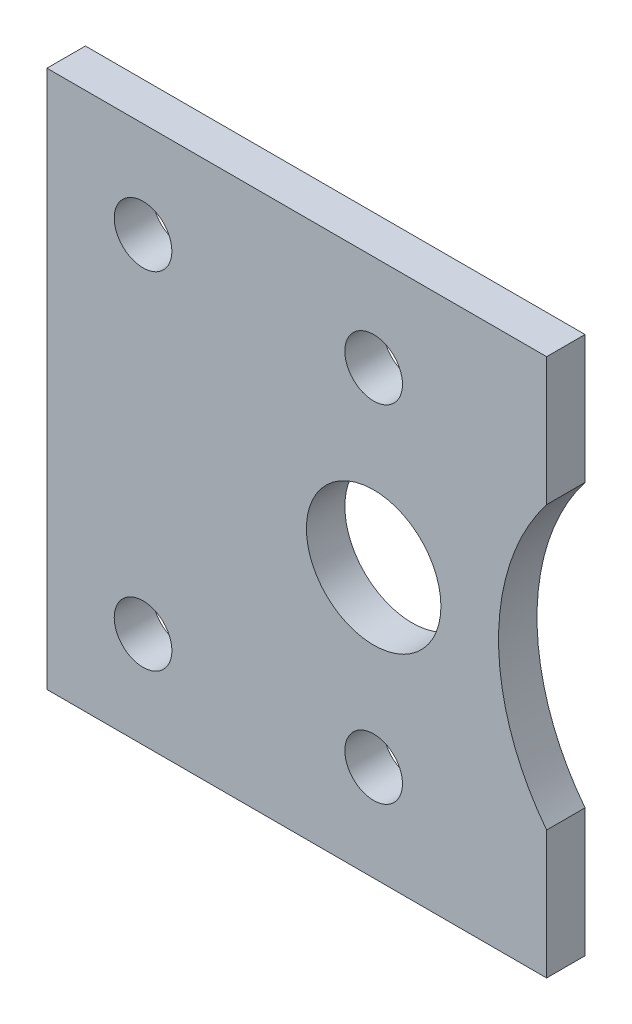
ISO-10303-21;
HEADER;
FILE_DESCRIPTION(('STEP AP214'),'2;1');
FILE_NAME('part.step','',(''),(''),'','','');
FILE_SCHEMA(('AUTOMOTIVE_DESIGN { 1 0 10303 214 1 1 1 1 }'));
ENDSEC;
DATA;
#1=APPLICATION_CONTEXT('core data for automotive mechanical design processes');
#2=APPLICATION_PROTOCOL_DEFINITION('international standard','automotive_design',2000,#1);
#3=PRODUCT_CONTEXT('',#1,'mechanical');
#4=PRODUCT('Part','Part','',(#3));
#5=PRODUCT_RELATED_PRODUCT_CATEGORY('part','',(#4));
#6=PRODUCT_DEFINITION_FORMATION('','',#4);
#7=PRODUCT_DEFINITION_CONTEXT('part definition',#1,'design');
#8=PRODUCT_DEFINITION('design','',#6,#7);
#9=PRODUCT_DEFINITION_SHAPE('','',#8);
#10=(LENGTH_UNIT() NAMED_UNIT(*) SI_UNIT(.MILLI.,.METRE.));
#11=(NAMED_UNIT(*) PLANE_ANGLE_UNIT() SI_UNIT($,.RADIAN.));
#12=(NAMED_UNIT(*) SI_UNIT($,.STERADIAN.) SOLID_ANGLE_UNIT());
#13=UNCERTAINTY_MEASURE_WITH_UNIT(LENGTH_MEASURE(1.E-05),#10,'distance_accuracy_value','');
#14=(GEOMETRIC_REPRESENTATION_CONTEXT(3) GLOBAL_UNCERTAINTY_ASSIGNED_CONTEXT((#13)) GLOBAL_UNIT_ASSIGNED_CONTEXT((#10,
#11,#12)) REPRESENTATION_CONTEXT('',''));
#15=CARTESIAN_POINT('',(0.,0.,0.));
#16=DIRECTION('',(0.,0.,1.));
#17=DIRECTION('',(1.,0.,0.));
#18=AXIS2_PLACEMENT_3D('',#15,#16,#17);
#19=CARTESIAN_POINT('',(18.5,0.,2.));
#20=DIRECTION('',(0.,0.,1.));
#21=DIRECTION('',(1.,0.,0.));
#22=AXIS2_PLACEMENT_3D('',#19,#20,#21);
#23=PLANE('',#22);
#24=CARTESIAN_POINT('',(-12.,-9.,2.));
#25=DIRECTION('',(0.,0.,1.));
#26=DIRECTION('',(-1.,0.,0.));
#27=AXIS2_PLACEMENT_3D('',#24,#25,#26);
#28=CIRCLE('',#27,1.5);
#29=CARTESIAN_POINT('',(-13.5,-9.,2.));
#30=VERTEX_POINT('',#29);
#31=EDGE_CURVE('E203',#30,#30,#28,.T.);
#32=ORIENTED_EDGE('',*,*,#31,.F.);
#33=EDGE_LOOP('',(#32));
#34=FACE_BOUND('',#33,.T.);
#35=CARTESIAN_POINT('',(-12.,9.,2.));
#36=DIRECTION('',(0.,0.,1.));
#37=DIRECTION('',(1.,0.,0.));
#38=AXIS2_PLACEMENT_3D('',#35,#36,#37);
#39=CIRCLE('',#38,1.5);
#40=CARTESIAN_POINT('',(-10.5,9.,2.));
#41=VERTEX_POINT('',#40);
#42=EDGE_CURVE('E215',#41,#41,#39,.T.);
#43=ORIENTED_EDGE('',*,*,#42,.F.);
#44=EDGE_LOOP('',(#43));
#45=FACE_BOUND('',#44,.T.);
#46=DIRECTION('',(0.,-1.,0.));
#47=VECTOR('',#46,1.);
#48=CARTESIAN_POINT('',(-17.,14.,2.));
#49=LINE('',#48,#47);
#50=CARTESIAN_POINT('',(-17.,14.,2.));
#51=VERTEX_POINT('',#50);
#52=CARTESIAN_POINT('',(-17.,-14.,2.));
#53=VERTEX_POINT('',#52);
#54=EDGE_CURVE('E139',#51,#53,#49,.T.);
#55=ORIENTED_EDGE('',*,*,#54,.T.);
#56=DIRECTION('',(1.,0.,0.));
#57=VECTOR('',#56,1.);
#58=CARTESIAN_POINT('',(-17.,-14.,2.));
#59=LINE('',#58,#57);
#60=CARTESIAN_POINT('',(9.,-14.,2.));
#61=VERTEX_POINT('',#60);
#62=EDGE_CURVE('E97',#53,#61,#59,.T.);
#63=ORIENTED_EDGE('',*,*,#62,.T.);
#64=DIRECTION('',(0.,1.,0.));
#65=VECTOR('',#64,1.);
#66=CARTESIAN_POINT('',(9.,-14.,2.));
#67=LINE('',#66,#65);
#68=CARTESIAN_POINT('',(9.,-7.33143914930759,2.));
#69=VERTEX_POINT('',#68);
#70=EDGE_CURVE('E110',#61,#69,#67,.T.);
#71=ORIENTED_EDGE('',*,*,#70,.T.);
#72=CARTESIAN_POINT('',(18.5,0.,2.));
#73=DIRECTION('',(0.,0.,-1.));
#74=DIRECTION('',(1.,0.,0.));
#75=AXIS2_PLACEMENT_3D('',#72,#73,#74);
#76=CIRCLE('',#75,12.);
#77=CARTESIAN_POINT('',(9.,7.33143914930759,2.));
#78=VERTEX_POINT('',#77);
#79=EDGE_CURVE('E104',#69,#78,#76,.T.);
#80=ORIENTED_EDGE('',*,*,#79,.T.);
#81=DIRECTION('',(0.,1.,0.));
#82=VECTOR('',#81,1.);
#83=CARTESIAN_POINT('',(9.,7.33143914930759,2.));
#84=LINE('',#83,#82);
#85=CARTESIAN_POINT('',(9.,14.,2.));
#86=VERTEX_POINT('',#85);
#87=EDGE_CURVE('E108',#78,#86,#84,.T.);
#88=ORIENTED_EDGE('',*,*,#87,.T.);
#89=DIRECTION('',(-1.,0.,0.));
#90=VECTOR('',#89,1.);
#91=CARTESIAN_POINT('',(9.,14.,2.));
#92=LINE('',#91,#90);
#93=EDGE_CURVE('E60',#86,#51,#92,.T.);
#94=ORIENTED_EDGE('',*,*,#93,.T.);
#95=EDGE_LOOP('',(#55,#63,#71,#80,#88,#94));
#96=FACE_BOUND('',#95,.T.);
#97=CARTESIAN_POINT('',(0.,0.,2.));
#98=DIRECTION('',(0.,0.,1.));
#99=DIRECTION('',(1.,0.,0.));
#100=AXIS2_PLACEMENT_3D('',#97,#98,#99);
#101=CIRCLE('',#100,3.5);
#102=CARTESIAN_POINT('',(3.5,0.,2.));
#103=VERTEX_POINT('',#102);
#104=EDGE_CURVE('E132',#103,#103,#101,.T.);
#105=ORIENTED_EDGE('',*,*,#104,.F.);
#106=EDGE_LOOP('',(#105));
#107=FACE_BOUND('',#106,.T.);
#108=CARTESIAN_POINT('',(0.,9.,2.));
#109=DIRECTION('',(0.,0.,1.));
#110=DIRECTION('',(1.,0.,0.));
#111=AXIS2_PLACEMENT_3D('',#108,#109,#110);
#112=CIRCLE('',#111,1.5);
#113=CARTESIAN_POINT('',(1.5,9.,2.));
#114=VERTEX_POINT('',#113);
#115=EDGE_CURVE('E209',#114,#114,#112,.T.);
#116=ORIENTED_EDGE('',*,*,#115,.F.);
#117=EDGE_LOOP('',(#116));
#118=FACE_BOUND('',#117,.T.);
#119=CARTESIAN_POINT('',(0.,-9.,2.));
#120=DIRECTION('',(0.,0.,1.));
#121=DIRECTION('',(-1.,0.,0.));
#122=AXIS2_PLACEMENT_3D('',#119,#120,#121);
#123=CIRCLE('',#122,1.5);
#124=CARTESIAN_POINT('',(-1.5,-9.,2.));
#125=VERTEX_POINT('',#124);
#126=EDGE_CURVE('E194',#125,#125,#123,.T.);
#127=ORIENTED_EDGE('',*,*,#126,.F.);
#128=EDGE_LOOP('',(#127));
#129=FACE_BOUND('',#128,.T.);
#130=ADVANCED_FACE('F43',(#34,#45,#96,#107,#118,#129),#23,.T.);
#131=CARTESIAN_POINT('',(18.5,0.,0.));
#132=DIRECTION('',(0.,0.,1.));
#133=DIRECTION('',(1.,0.,0.));
#134=AXIS2_PLACEMENT_3D('',#131,#132,#133);
#135=PLANE('',#134);
#136=DIRECTION('',(0.,-1.,0.));
#137=VECTOR('',#136,1.);
#138=CARTESIAN_POINT('',(-17.,14.,0.));
#139=LINE('',#138,#137);
#140=CARTESIAN_POINT('',(-17.,14.,0.));
#141=VERTEX_POINT('',#140);
#142=CARTESIAN_POINT('',(-17.,-14.,0.));
#143=VERTEX_POINT('',#142);
#144=EDGE_CURVE('E128',#141,#143,#139,.T.);
#145=ORIENTED_EDGE('',*,*,#144,.F.);
#146=DIRECTION('',(-1.,0.,0.));
#147=VECTOR('',#146,1.);
#148=CARTESIAN_POINT('',(9.,14.,0.));
#149=LINE('',#148,#147);
#150=CARTESIAN_POINT('',(9.,14.,0.));
#151=VERTEX_POINT('',#150);
#152=EDGE_CURVE('E89',#151,#141,#149,.T.);
#153=ORIENTED_EDGE('',*,*,#152,.F.);
#154=DIRECTION('',(0.,1.,0.));
#155=VECTOR('',#154,1.);
#156=CARTESIAN_POINT('',(9.,7.33143914930759,0.));
#157=LINE('',#156,#155);
#158=CARTESIAN_POINT('',(9.,7.33143914930759,0.));
#159=VERTEX_POINT('',#158);
#160=EDGE_CURVE('E83',#159,#151,#157,.T.);
#161=ORIENTED_EDGE('',*,*,#160,.F.);
#162=CARTESIAN_POINT('',(18.5,0.,0.));
#163=DIRECTION('',(0.,0.,-1.));
#164=DIRECTION('',(1.,0.,0.));
#165=AXIS2_PLACEMENT_3D('',#162,#163,#164);
#166=CIRCLE('',#165,12.);
#167=CARTESIAN_POINT('',(9.,-7.33143914930759,0.));
#168=VERTEX_POINT('',#167);
#169=EDGE_CURVE('E118',#168,#159,#166,.T.);
#170=ORIENTED_EDGE('',*,*,#169,.F.);
#171=DIRECTION('',(0.,1.,0.));
#172=VECTOR('',#171,1.);
#173=CARTESIAN_POINT('',(9.,-14.,0.));
#174=LINE('',#173,#172);
#175=CARTESIAN_POINT('',(9.,-14.,0.));
#176=VERTEX_POINT('',#175);
#177=EDGE_CURVE('E134',#176,#168,#174,.T.);
#178=ORIENTED_EDGE('',*,*,#177,.F.);
#179=DIRECTION('',(1.,0.,0.));
#180=VECTOR('',#179,1.);
#181=CARTESIAN_POINT('',(-17.,-14.,0.));
#182=LINE('',#181,#180);
#183=EDGE_CURVE('E131',#143,#176,#182,.T.);
#184=ORIENTED_EDGE('',*,*,#183,.F.);
#185=EDGE_LOOP('',(#145,#153,#161,#170,#178,#184));
#186=FACE_BOUND('',#185,.T.);
#187=CARTESIAN_POINT('',(0.,0.,0.));
#188=DIRECTION('',(0.,0.,1.));
#189=DIRECTION('',(1.,0.,0.));
#190=AXIS2_PLACEMENT_3D('',#187,#188,#189);
#191=CIRCLE('',#190,3.5);
#192=CARTESIAN_POINT('',(3.5,0.,0.));
#193=VERTEX_POINT('',#192);
#194=EDGE_CURVE('E218',#193,#193,#191,.T.);
#195=ORIENTED_EDGE('',*,*,#194,.T.);
#196=EDGE_LOOP('',(#195));
#197=FACE_BOUND('',#196,.T.);
#198=CARTESIAN_POINT('',(-12.,9.,0.));
#199=DIRECTION('',(0.,0.,1.));
#200=DIRECTION('',(1.,0.,0.));
#201=AXIS2_PLACEMENT_3D('',#198,#199,#200);
#202=CIRCLE('',#201,1.5);
#203=CARTESIAN_POINT('',(-10.5,9.,0.));
#204=VERTEX_POINT('',#203);
#205=EDGE_CURVE('E212',#204,#204,#202,.T.);
#206=ORIENTED_EDGE('',*,*,#205,.T.);
#207=EDGE_LOOP('',(#206));
#208=FACE_BOUND('',#207,.T.);
#209=CARTESIAN_POINT('',(0.,9.,0.));
#210=DIRECTION('',(0.,0.,1.));
#211=DIRECTION('',(1.,0.,0.));
#212=AXIS2_PLACEMENT_3D('',#209,#210,#211);
#213=CIRCLE('',#212,1.5);
#214=CARTESIAN_POINT('',(1.5,9.,0.));
#215=VERTEX_POINT('',#214);
#216=EDGE_CURVE('E206',#215,#215,#213,.T.);
#217=ORIENTED_EDGE('',*,*,#216,.T.);
#218=EDGE_LOOP('',(#217));
#219=FACE_BOUND('',#218,.T.);
#220=CARTESIAN_POINT('',(-12.,-9.,0.));
#221=DIRECTION('',(0.,0.,1.));
#222=DIRECTION('',(-1.,0.,0.));
#223=AXIS2_PLACEMENT_3D('',#220,#221,#222);
#224=CIRCLE('',#223,1.5);
#225=CARTESIAN_POINT('',(-13.5,-9.,0.));
#226=VERTEX_POINT('',#225);
#227=EDGE_CURVE('E200',#226,#226,#224,.T.);
#228=ORIENTED_EDGE('',*,*,#227,.T.);
#229=EDGE_LOOP('',(#228));
#230=FACE_BOUND('',#229,.T.);
#231=CARTESIAN_POINT('',(0.,-9.,0.));
#232=DIRECTION('',(0.,0.,1.));
#233=DIRECTION('',(-1.,0.,0.));
#234=AXIS2_PLACEMENT_3D('',#231,#232,#233);
#235=CIRCLE('',#234,1.5);
#236=CARTESIAN_POINT('',(-1.5,-9.,0.));
#237=VERTEX_POINT('',#236);
#238=EDGE_CURVE('E197',#237,#237,#235,.T.);
#239=ORIENTED_EDGE('',*,*,#238,.T.);
#240=EDGE_LOOP('',(#239));
#241=FACE_BOUND('',#240,.T.);
#242=ADVANCED_FACE('F148',(#186,#197,#208,#219,#230,#241),#135,.F.);
#243=CARTESIAN_POINT('',(-17.,14.,2.));
#244=DIRECTION('',(1.,0.,0.));
#245=DIRECTION('',(0.,0.,-1.));
#246=AXIS2_PLACEMENT_3D('',#243,#244,#245);
#247=PLANE('',#246);
#248=ORIENTED_EDGE('',*,*,#144,.T.);
#249=DIRECTION('',(0.,0.,-1.));
#250=VECTOR('',#249,1.);
#251=CARTESIAN_POINT('',(-17.,-14.,2.));
#252=LINE('',#251,#250);
#253=EDGE_CURVE('E11',#53,#143,#252,.T.);
#254=ORIENTED_EDGE('',*,*,#253,.F.);
#255=ORIENTED_EDGE('',*,*,#54,.F.);
#256=DIRECTION('',(0.,0.,-1.));
#257=VECTOR('',#256,1.);
#258=CARTESIAN_POINT('',(-17.,14.,2.));
#259=LINE('',#258,#257);
#260=EDGE_CURVE('E124',#51,#141,#259,.T.);
#261=ORIENTED_EDGE('',*,*,#260,.T.);
#262=EDGE_LOOP('',(#248,#254,#255,#261));
#263=FACE_BOUND('',#262,.T.);
#264=ADVANCED_FACE('F45',(#263),#247,.F.);
#265=CARTESIAN_POINT('',(-17.,-14.,2.));
#266=DIRECTION('',(0.,1.,0.));
#267=DIRECTION('',(0.,0.,1.));
#268=AXIS2_PLACEMENT_3D('',#265,#266,#267);
#269=PLANE('',#268);
#270=ORIENTED_EDGE('',*,*,#183,.T.);
#271=DIRECTION('',(0.,0.,-1.));
#272=VECTOR('',#271,1.);
#273=CARTESIAN_POINT('',(9.,-14.,2.));
#274=LINE('',#273,#272);
#275=EDGE_CURVE('E52',#61,#176,#274,.T.);
#276=ORIENTED_EDGE('',*,*,#275,.F.);
#277=ORIENTED_EDGE('',*,*,#62,.F.);
#278=ORIENTED_EDGE('',*,*,#253,.T.);
#279=EDGE_LOOP('',(#270,#276,#277,#278));
#280=FACE_BOUND('',#279,.T.);
#281=ADVANCED_FACE('F290',(#280),#269,.F.);
#282=CARTESIAN_POINT('',(9.,-14.,2.));
#283=DIRECTION('',(-1.,0.,0.));
#284=DIRECTION('',(0.,0.,1.));
#285=AXIS2_PLACEMENT_3D('',#282,#283,#284);
#286=PLANE('',#285);
#287=ORIENTED_EDGE('',*,*,#177,.T.);
#288=DIRECTION('',(0.,0.,-1.));
#289=VECTOR('',#288,1.);
#290=CARTESIAN_POINT('',(9.,-7.33143914930759,2.));
#291=LINE('',#290,#289);
#292=EDGE_CURVE('E119',#69,#168,#291,.T.);
#293=ORIENTED_EDGE('',*,*,#292,.F.);
#294=ORIENTED_EDGE('',*,*,#70,.F.);
#295=ORIENTED_EDGE('',*,*,#275,.T.);
#296=EDGE_LOOP('',(#287,#293,#294,#295));
#297=FACE_BOUND('',#296,.T.);
#298=ADVANCED_FACE('F145',(#297),#286,.F.);
#299=CARTESIAN_POINT('',(18.5,0.,2.));
#300=DIRECTION('',(0.,0.,-1.));
#301=DIRECTION('',(-1.,0.,0.));
#302=AXIS2_PLACEMENT_3D('',#299,#300,#301);
#303=CYLINDRICAL_SURFACE('',#302,12.);
#304=ORIENTED_EDGE('',*,*,#169,.T.);
#305=DIRECTION('',(0.,0.,-1.));
#306=VECTOR('',#305,1.);
#307=CARTESIAN_POINT('',(9.,7.33143914930759,2.));
#308=LINE('',#307,#306);
#309=EDGE_CURVE('E115',#78,#159,#308,.T.);
#310=ORIENTED_EDGE('',*,*,#309,.F.);
#311=ORIENTED_EDGE('',*,*,#79,.F.);
#312=ORIENTED_EDGE('',*,*,#292,.T.);
#313=EDGE_LOOP('',(#304,#310,#311,#312));
#314=FACE_BOUND('',#313,.T.);
#315=ADVANCED_FACE('F116',(#314),#303,.F.);
#316=CARTESIAN_POINT('',(9.,7.33143914930759,2.));
#317=DIRECTION('',(-1.,0.,0.));
#318=DIRECTION('',(0.,0.,1.));
#319=AXIS2_PLACEMENT_3D('',#316,#317,#318);
#320=PLANE('',#319);
#321=ORIENTED_EDGE('',*,*,#160,.T.);
#322=DIRECTION('',(0.,0.,-1.));
#323=VECTOR('',#322,1.);
#324=CARTESIAN_POINT('',(9.,14.,2.));
#325=LINE('',#324,#323);
#326=EDGE_CURVE('E120',#86,#151,#325,.T.);
#327=ORIENTED_EDGE('',*,*,#326,.F.);
#328=ORIENTED_EDGE('',*,*,#87,.F.);
#329=ORIENTED_EDGE('',*,*,#309,.T.);
#330=EDGE_LOOP('',(#321,#327,#328,#329));
#331=FACE_BOUND('',#330,.T.);
#332=ADVANCED_FACE('F122',(#331),#320,.F.);
#333=CARTESIAN_POINT('',(9.,14.,2.));
#334=DIRECTION('',(0.,-1.,0.));
#335=DIRECTION('',(0.,0.,-1.));
#336=AXIS2_PLACEMENT_3D('',#333,#334,#335);
#337=PLANE('',#336);
#338=ORIENTED_EDGE('',*,*,#152,.T.);
#339=ORIENTED_EDGE('',*,*,#260,.F.);
#340=ORIENTED_EDGE('',*,*,#93,.F.);
#341=ORIENTED_EDGE('',*,*,#326,.T.);
#342=EDGE_LOOP('',(#338,#339,#340,#341));
#343=FACE_BOUND('',#342,.T.);
#344=ADVANCED_FACE('F153',(#343),#337,.F.);
#345=CARTESIAN_POINT('',(0.,0.,2.));
#346=DIRECTION('',(0.,0.,-1.));
#347=DIRECTION('',(-1.,0.,0.));
#348=AXIS2_PLACEMENT_3D('',#345,#346,#347);
#349=CYLINDRICAL_SURFACE('',#348,3.5);
#350=ORIENTED_EDGE('',*,*,#104,.T.);
#351=EDGE_LOOP('',(#350));
#352=FACE_BOUND('',#351,.T.);
#353=ORIENTED_EDGE('',*,*,#194,.F.);
#354=EDGE_LOOP('',(#353));
#355=FACE_BOUND('',#354,.T.);
#356=ADVANCED_FACE('F155',(#352,#355),#349,.F.);
#357=CARTESIAN_POINT('',(-12.,9.,2.));
#358=DIRECTION('',(0.,0.,-1.));
#359=DIRECTION('',(-1.,0.,0.));
#360=AXIS2_PLACEMENT_3D('',#357,#358,#359);
#361=CYLINDRICAL_SURFACE('',#360,1.5);
#362=ORIENTED_EDGE('',*,*,#42,.T.);
#363=EDGE_LOOP('',(#362));
#364=FACE_BOUND('',#363,.T.);
#365=ORIENTED_EDGE('',*,*,#205,.F.);
#366=EDGE_LOOP('',(#365));
#367=FACE_BOUND('',#366,.T.);
#368=ADVANCED_FACE('F161',(#364,#367),#361,.F.);
#369=CARTESIAN_POINT('',(0.,9.,2.));
#370=DIRECTION('',(0.,0.,-1.));
#371=DIRECTION('',(-1.,0.,0.));
#372=AXIS2_PLACEMENT_3D('',#369,#370,#371);
#373=CYLINDRICAL_SURFACE('',#372,1.5);
#374=ORIENTED_EDGE('',*,*,#115,.T.);
#375=EDGE_LOOP('',(#374));
#376=FACE_BOUND('',#375,.T.);
#377=ORIENTED_EDGE('',*,*,#216,.F.);
#378=EDGE_LOOP('',(#377));
#379=FACE_BOUND('',#378,.T.);
#380=ADVANCED_FACE('F177',(#376,#379),#373,.F.);
#381=CARTESIAN_POINT('',(-12.,-9.,2.));
#382=DIRECTION('',(0.,0.,-1.));
#383=DIRECTION('',(-1.,0.,0.));
#384=AXIS2_PLACEMENT_3D('',#381,#382,#383);
#385=CYLINDRICAL_SURFACE('',#384,1.5);
#386=ORIENTED_EDGE('',*,*,#31,.T.);
#387=EDGE_LOOP('',(#386));
#388=FACE_BOUND('',#387,.T.);
#389=ORIENTED_EDGE('',*,*,#227,.F.);
#390=EDGE_LOOP('',(#389));
#391=FACE_BOUND('',#390,.T.);
#392=ADVANCED_FACE('F181',(#388,#391),#385,.F.);
#393=CARTESIAN_POINT('',(0.,-9.,2.));
#394=DIRECTION('',(0.,0.,-1.));
#395=DIRECTION('',(-1.,0.,0.));
#396=AXIS2_PLACEMENT_3D('',#393,#394,#395);
#397=CYLINDRICAL_SURFACE('',#396,1.5);
#398=ORIENTED_EDGE('',*,*,#126,.T.);
#399=EDGE_LOOP('',(#398));
#400=FACE_BOUND('',#399,.T.);
#401=ORIENTED_EDGE('',*,*,#238,.F.);
#402=EDGE_LOOP('',(#401));
#403=FACE_BOUND('',#402,.T.);
#404=ADVANCED_FACE('F185',(#400,#403),#397,.F.);
#405=CLOSED_SHELL('',(#130,#242,#264,#281,#298,#315,#332,#344,#356,#368,#380,#392,#404));
#406=MANIFOLD_SOLID_BREP('B2',#405);
#407=ADVANCED_BREP_SHAPE_REPRESENTATION('',(#18,#406),#14);
#408=SHAPE_DEFINITION_REPRESENTATION(#9,#407);
ENDSEC;
END-ISO-10303-21;
